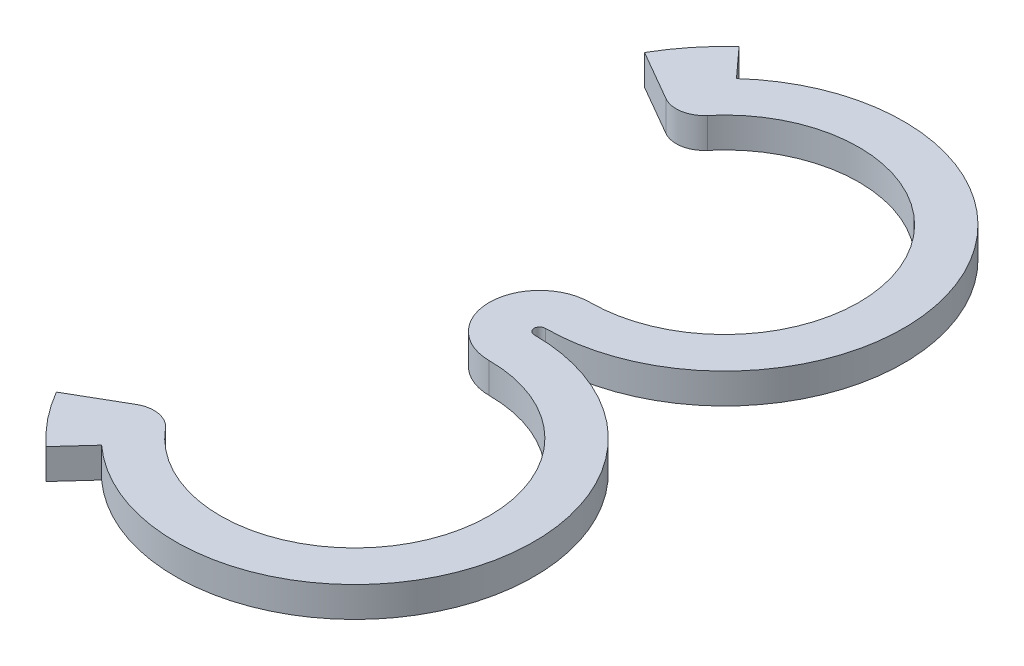
ISO-10303-21;
HEADER;
FILE_DESCRIPTION(('STEP AP214'),'2;1');
FILE_NAME('part.step','',(''),(''),'','','');
FILE_SCHEMA(('AUTOMOTIVE_DESIGN { 1 0 10303 214 1 1 1 1 }'));
ENDSEC;
DATA;
#1=APPLICATION_CONTEXT('core data for automotive mechanical design processes');
#2=APPLICATION_PROTOCOL_DEFINITION('international standard','automotive_design',2000,#1);
#3=PRODUCT_CONTEXT('',#1,'mechanical');
#4=PRODUCT('Part','Part','',(#3));
#5=PRODUCT_RELATED_PRODUCT_CATEGORY('part','',(#4));
#6=PRODUCT_DEFINITION_FORMATION('','',#4);
#7=PRODUCT_DEFINITION_CONTEXT('part definition',#1,'design');
#8=PRODUCT_DEFINITION('design','',#6,#7);
#9=PRODUCT_DEFINITION_SHAPE('','',#8);
#10=(LENGTH_UNIT() NAMED_UNIT(*) SI_UNIT(.MILLI.,.METRE.));
#11=(NAMED_UNIT(*) PLANE_ANGLE_UNIT() SI_UNIT($,.RADIAN.));
#12=(NAMED_UNIT(*) SI_UNIT($,.STERADIAN.) SOLID_ANGLE_UNIT());
#13=UNCERTAINTY_MEASURE_WITH_UNIT(LENGTH_MEASURE(1.E-05),#10,'distance_accuracy_value','');
#14=(GEOMETRIC_REPRESENTATION_CONTEXT(3) GLOBAL_UNCERTAINTY_ASSIGNED_CONTEXT((#13)) GLOBAL_UNIT_ASSIGNED_CONTEXT((#10,
#11,#12)) REPRESENTATION_CONTEXT('',''));
#15=CARTESIAN_POINT('',(0.,0.,0.));
#16=DIRECTION('',(0.,0.,1.));
#17=DIRECTION('',(1.,0.,0.));
#18=AXIS2_PLACEMENT_3D('',#15,#16,#17);
#19=CARTESIAN_POINT('',(-11.1193168768529,2.7,-9.306491938004));
#20=DIRECTION('',(0.,-1.,0.));
#21=DIRECTION('',(0.,0.,-1.));
#22=AXIS2_PLACEMENT_3D('',#19,#20,#21);
#23=CYLINDRICAL_SURFACE('',#22,2.5);
#24=CARTESIAN_POINT('',(-11.1193168768529,0.,-9.306491938004));
#25=DIRECTION('',(0.,1.,0.));
#26=DIRECTION('',(0.,0.,-1.));
#27=AXIS2_PLACEMENT_3D('',#24,#25,#26);
#28=CIRCLE('',#27,2.5);
#29=CARTESIAN_POINT('',(-12.3693168768529,0.,-7.1414284285429));
#30=VERTEX_POINT('',#29);
#31=CARTESIAN_POINT('',(-9.20219327739554,0.,-7.70192436248606));
#32=VERTEX_POINT('',#31);
#33=EDGE_CURVE('E176',#30,#32,#28,.T.);
#34=ORIENTED_EDGE('',*,*,#33,.T.);
#35=DIRECTION('',(0.,-1.,0.));
#36=VECTOR('',#35,1.);
#37=CARTESIAN_POINT('',(-9.20219327739554,2.7,-7.70192436248606));
#38=LINE('',#37,#36);
#39=CARTESIAN_POINT('',(-9.20219327739554,2.7,-7.70192436248606));
#40=VERTEX_POINT('',#39);
#41=EDGE_CURVE('E11',#40,#32,#38,.T.);
#42=ORIENTED_EDGE('',*,*,#41,.F.);
#43=CARTESIAN_POINT('',(-11.1193168768529,2.7,-9.306491938004));
#44=DIRECTION('',(0.,1.,0.));
#45=DIRECTION('',(0.,0.,-1.));
#46=AXIS2_PLACEMENT_3D('',#43,#44,#45);
#47=CIRCLE('',#46,2.5);
#48=CARTESIAN_POINT('',(-12.3693168768529,2.7,-7.1414284285429));
#49=VERTEX_POINT('',#48);
#50=EDGE_CURVE('E216',#49,#40,#47,.T.);
#51=ORIENTED_EDGE('',*,*,#50,.F.);
#52=DIRECTION('',(0.,-1.,0.));
#53=VECTOR('',#52,1.);
#54=CARTESIAN_POINT('',(-12.3693168768529,2.7,-7.1414284285429));
#55=LINE('',#54,#53);
#56=EDGE_CURVE('E172',#49,#30,#55,.T.);
#57=ORIENTED_EDGE('',*,*,#56,.T.);
#58=EDGE_LOOP('',(#34,#42,#51,#57));
#59=FACE_BOUND('',#58,.T.);
#60=ADVANCED_FACE('F39',(#59),#23,.T.);
#61=CARTESIAN_POINT('',(0.,2.7,0.));
#62=DIRECTION('',(0.,-1.,0.));
#63=DIRECTION('',(0.,0.,-1.));
#64=AXIS2_PLACEMENT_3D('',#61,#62,#63);
#65=CYLINDRICAL_SURFACE('',#64,12.);
#66=CARTESIAN_POINT('',(0.,0.,0.));
#67=DIRECTION('',(0.,-1.,0.));
#68=DIRECTION('',(0.,0.,1.));
#69=AXIS2_PLACEMENT_3D('',#66,#67,#68);
#70=CIRCLE('',#69,12.);
#71=CARTESIAN_POINT('',(0.,0.,12.));
#72=VERTEX_POINT('',#71);
#73=EDGE_CURVE('E180',#32,#72,#70,.T.);
#74=ORIENTED_EDGE('',*,*,#73,.T.);
#75=DIRECTION('',(0.,-1.,0.));
#76=VECTOR('',#75,1.);
#77=CARTESIAN_POINT('',(0.,2.7,12.));
#78=LINE('',#77,#76);
#79=CARTESIAN_POINT('',(0.,2.7,12.));
#80=VERTEX_POINT('',#79);
#81=EDGE_CURVE('E48',#80,#72,#78,.T.);
#82=ORIENTED_EDGE('',*,*,#81,.F.);
#83=CARTESIAN_POINT('',(0.,2.7,0.));
#84=DIRECTION('',(0.,-1.,0.));
#85=DIRECTION('',(0.,0.,1.));
#86=AXIS2_PLACEMENT_3D('',#83,#84,#85);
#87=CIRCLE('',#86,12.);
#88=EDGE_CURVE('E117',#40,#80,#87,.T.);
#89=ORIENTED_EDGE('',*,*,#88,.F.);
#90=ORIENTED_EDGE('',*,*,#41,.T.);
#91=EDGE_LOOP('',(#74,#82,#89,#90));
#92=FACE_BOUND('',#91,.T.);
#93=ADVANCED_FACE('F324',(#92),#65,.F.);
#94=CARTESIAN_POINT('',(0.,2.7,16.5));
#95=DIRECTION('',(0.,-1.,0.));
#96=DIRECTION('',(0.,0.,-1.));
#97=AXIS2_PLACEMENT_3D('',#94,#95,#96);
#98=CYLINDRICAL_SURFACE('',#97,4.5);
#99=CARTESIAN_POINT('',(0.,0.,16.5));
#100=DIRECTION('',(0.,1.,0.));
#101=DIRECTION('',(0.,0.,1.));
#102=AXIS2_PLACEMENT_3D('',#99,#100,#101);
#103=CIRCLE('',#102,4.5);
#104=CARTESIAN_POINT('',(0.,0.,21.));
#105=VERTEX_POINT('',#104);
#106=EDGE_CURVE('E183',#72,#105,#103,.T.);
#107=ORIENTED_EDGE('',*,*,#106,.T.);
#108=DIRECTION('',(0.,-1.,0.));
#109=VECTOR('',#108,1.);
#110=CARTESIAN_POINT('',(0.,2.7,21.));
#111=LINE('',#110,#109);
#112=CARTESIAN_POINT('',(0.,2.7,21.));
#113=VERTEX_POINT('',#112);
#114=EDGE_CURVE('E251',#113,#105,#111,.T.);
#115=ORIENTED_EDGE('',*,*,#114,.F.);
#116=CARTESIAN_POINT('',(0.,2.7,16.5));
#117=DIRECTION('',(0.,1.,0.));
#118=DIRECTION('',(0.,0.,1.));
#119=AXIS2_PLACEMENT_3D('',#116,#117,#118);
#120=CIRCLE('',#119,4.5);
#121=EDGE_CURVE('E261',#80,#113,#120,.T.);
#122=ORIENTED_EDGE('',*,*,#121,.F.);
#123=ORIENTED_EDGE('',*,*,#81,.T.);
#124=EDGE_LOOP('',(#107,#115,#122,#123));
#125=FACE_BOUND('',#124,.T.);
#126=ADVANCED_FACE('F259',(#125),#98,.T.);
#127=CARTESIAN_POINT('',(0.,2.7,33.));
#128=DIRECTION('',(0.,-1.,0.));
#129=DIRECTION('',(0.,0.,-1.));
#130=AXIS2_PLACEMENT_3D('',#127,#128,#129);
#131=CYLINDRICAL_SURFACE('',#130,12.);
#132=CARTESIAN_POINT('',(0.,0.,33.));
#133=DIRECTION('',(0.,-1.,0.));
#134=DIRECTION('',(0.,0.,-1.));
#135=AXIS2_PLACEMENT_3D('',#132,#133,#134);
#136=CIRCLE('',#135,12.);
#137=CARTESIAN_POINT('',(-9.20219327739554,0.,40.7019243624861));
#138=VERTEX_POINT('',#137);
#139=EDGE_CURVE('E186',#105,#138,#136,.T.);
#140=ORIENTED_EDGE('',*,*,#139,.T.);
#141=DIRECTION('',(0.,-1.,0.));
#142=VECTOR('',#141,1.);
#143=CARTESIAN_POINT('',(-9.20219327739554,2.7,40.7019243624861));
#144=LINE('',#143,#142);
#145=CARTESIAN_POINT('',(-9.20219327739554,2.7,40.7019243624861));
#146=VERTEX_POINT('',#145);
#147=EDGE_CURVE('E247',#146,#138,#144,.T.);
#148=ORIENTED_EDGE('',*,*,#147,.F.);
#149=CARTESIAN_POINT('',(0.,2.7,33.));
#150=DIRECTION('',(0.,-1.,0.));
#151=DIRECTION('',(0.,0.,-1.));
#152=AXIS2_PLACEMENT_3D('',#149,#150,#151);
#153=CIRCLE('',#152,12.);
#154=EDGE_CURVE('E280',#113,#146,#153,.T.);
#155=ORIENTED_EDGE('',*,*,#154,.F.);
#156=ORIENTED_EDGE('',*,*,#114,.T.);
#157=EDGE_LOOP('',(#140,#148,#155,#156));
#158=FACE_BOUND('',#157,.T.);
#159=ADVANCED_FACE('F270',(#158),#131,.F.);
#160=CARTESIAN_POINT('',(-11.1193168768529,2.7,42.306491938004));
#161=DIRECTION('',(0.,-1.,0.));
#162=DIRECTION('',(0.,0.,-1.));
#163=AXIS2_PLACEMENT_3D('',#160,#161,#162);
#164=CYLINDRICAL_SURFACE('',#163,2.5);
#165=CARTESIAN_POINT('',(-11.1193168768529,0.,42.306491938004));
#166=DIRECTION('',(0.,1.,0.));
#167=DIRECTION('',(0.,0.,1.));
#168=AXIS2_PLACEMENT_3D('',#165,#166,#167);
#169=CIRCLE('',#168,2.5);
#170=CARTESIAN_POINT('',(-12.3693168768529,0.,40.1414284285429));
#171=VERTEX_POINT('',#170);
#172=EDGE_CURVE('E189',#138,#171,#169,.T.);
#173=ORIENTED_EDGE('',*,*,#172,.T.);
#174=DIRECTION('',(0.,-1.,0.));
#175=VECTOR('',#174,1.);
#176=CARTESIAN_POINT('',(-12.3693168768529,2.7,40.1414284285429));
#177=LINE('',#176,#175);
#178=CARTESIAN_POINT('',(-12.3693168768529,2.7,40.1414284285429));
#179=VERTEX_POINT('',#178);
#180=EDGE_CURVE('E243',#179,#171,#177,.T.);
#181=ORIENTED_EDGE('',*,*,#180,.F.);
#182=CARTESIAN_POINT('',(-11.1193168768529,2.7,42.306491938004));
#183=DIRECTION('',(0.,1.,0.));
#184=DIRECTION('',(0.,0.,1.));
#185=AXIS2_PLACEMENT_3D('',#182,#183,#184);
#186=CIRCLE('',#185,2.5);
#187=EDGE_CURVE('E276',#146,#179,#186,.T.);
#188=ORIENTED_EDGE('',*,*,#187,.F.);
#189=ORIENTED_EDGE('',*,*,#147,.T.);
#190=EDGE_LOOP('',(#173,#181,#188,#189));
#191=FACE_BOUND('',#190,.T.);
#192=ADVANCED_FACE('F274',(#191),#164,.T.);
#193=CARTESIAN_POINT('',(-12.3693168768529,2.7,40.1414284285429));
#194=DIRECTION('',(0.500000000000004,0.,0.866025403784436));
#195=DIRECTION('',(0.866025403784437,0.,-0.500000000000004));
#196=AXIS2_PLACEMENT_3D('',#193,#194,#195);
#197=PLANE('',#196);
#198=DIRECTION('',(-0.866025403784436,0.,0.500000000000004));
#199=VECTOR('',#198,1.);
#200=CARTESIAN_POINT('',(-12.3693168768529,0.,40.1414284285429));
#201=LINE('',#200,#199);
#202=CARTESIAN_POINT('',(-16.8874953737965,0.,42.7500000000001));
#203=VERTEX_POINT('',#202);
#204=EDGE_CURVE('E192',#171,#203,#201,.T.);
#205=ORIENTED_EDGE('',*,*,#204,.T.);
#206=DIRECTION('',(0.,-1.,0.));
#207=VECTOR('',#206,1.);
#208=CARTESIAN_POINT('',(-16.8874953737965,2.7,42.7500000000001));
#209=LINE('',#208,#207);
#210=CARTESIAN_POINT('',(-16.8874953737965,2.7,42.7500000000001));
#211=VERTEX_POINT('',#210);
#212=EDGE_CURVE('E239',#211,#203,#209,.T.);
#213=ORIENTED_EDGE('',*,*,#212,.F.);
#214=DIRECTION('',(-0.866025403784436,0.,0.500000000000004));
#215=VECTOR('',#214,1.);
#216=CARTESIAN_POINT('',(-12.3693168768529,2.7,40.1414284285429));
#217=LINE('',#216,#215);
#218=EDGE_CURVE('E279',#179,#211,#217,.T.);
#219=ORIENTED_EDGE('',*,*,#218,.F.);
#220=ORIENTED_EDGE('',*,*,#180,.T.);
#221=EDGE_LOOP('',(#205,#213,#219,#220));
#222=FACE_BOUND('',#221,.T.);
#223=ADVANCED_FACE('F337',(#222),#197,.F.);
#224=CARTESIAN_POINT('',(0.,2.7,33.));
#225=DIRECTION('',(0.,-1.,0.));
#226=DIRECTION('',(0.,0.,-1.));
#227=AXIS2_PLACEMENT_3D('',#224,#225,#226);
#228=CYLINDRICAL_SURFACE('',#227,19.5);
#229=CARTESIAN_POINT('',(0.,0.,33.));
#230=DIRECTION('',(0.,1.,0.));
#231=DIRECTION('',(0.,0.,1.));
#232=AXIS2_PLACEMENT_3D('',#229,#230,#231);
#233=CIRCLE('',#232,19.5);
#234=CARTESIAN_POINT('',(-13.1238028675343,0.,47.4227527987586));
#235=VERTEX_POINT('',#234);
#236=EDGE_CURVE('E195',#203,#235,#233,.T.);
#237=ORIENTED_EDGE('',*,*,#236,.T.);
#238=DIRECTION('',(0.,-1.,0.));
#239=VECTOR('',#238,1.);
#240=CARTESIAN_POINT('',(-13.1238028675343,2.7,47.4227527987586));
#241=LINE('',#240,#239);
#242=CARTESIAN_POINT('',(-13.1238028675343,2.7,47.4227527987586));
#243=VERTEX_POINT('',#242);
#244=EDGE_CURVE('E235',#243,#235,#241,.T.);
#245=ORIENTED_EDGE('',*,*,#244,.F.);
#246=CARTESIAN_POINT('',(0.,2.7,33.));
#247=DIRECTION('',(0.,1.,0.));
#248=DIRECTION('',(0.,0.,1.));
#249=AXIS2_PLACEMENT_3D('',#246,#247,#248);
#250=CIRCLE('',#249,19.5);
#251=EDGE_CURVE('E284',#211,#243,#250,.T.);
#252=ORIENTED_EDGE('',*,*,#251,.F.);
#253=ORIENTED_EDGE('',*,*,#212,.T.);
#254=EDGE_LOOP('',(#237,#245,#252,#253));
#255=FACE_BOUND('',#254,.T.);
#256=ADVANCED_FACE('F340',(#255),#228,.T.);
#257=CARTESIAN_POINT('',(-10.7682485066948,2.7,44.8340535784686));
#258=DIRECTION('',(-0.739628348654287,0.,-0.673015531668425));
#259=DIRECTION('',(-0.673015531668425,0.,0.739628348654287));
#260=AXIS2_PLACEMENT_3D('',#257,#258,#259);
#261=PLANE('',#260);
#262=DIRECTION('',(0.673015531668425,0.,-0.739628348654287));
#263=VECTOR('',#262,1.);
#264=CARTESIAN_POINT('',(-10.7682485066948,0.,44.8340535784686));
#265=LINE('',#264,#263);
#266=CARTESIAN_POINT('',(-10.7682485066948,0.,44.8340535784686));
#267=VERTEX_POINT('',#266);
#268=EDGE_CURVE('E198',#235,#267,#265,.T.);
#269=ORIENTED_EDGE('',*,*,#268,.T.);
#270=DIRECTION('',(0.,-1.,0.));
#271=VECTOR('',#270,1.);
#272=CARTESIAN_POINT('',(-10.7682485066948,2.7,44.8340535784686));
#273=LINE('',#272,#271);
#274=CARTESIAN_POINT('',(-10.7682485066948,2.7,44.8340535784686));
#275=VERTEX_POINT('',#274);
#276=EDGE_CURVE('E231',#275,#267,#273,.T.);
#277=ORIENTED_EDGE('',*,*,#276,.F.);
#278=DIRECTION('',(0.673015531668425,0.,-0.739628348654287));
#279=VECTOR('',#278,1.);
#280=CARTESIAN_POINT('',(-10.7682485066948,2.7,44.8340535784686));
#281=LINE('',#280,#279);
#282=EDGE_CURVE('E291',#243,#275,#281,.T.);
#283=ORIENTED_EDGE('',*,*,#282,.F.);
#284=ORIENTED_EDGE('',*,*,#244,.T.);
#285=EDGE_LOOP('',(#269,#277,#283,#284));
#286=FACE_BOUND('',#285,.T.);
#287=ADVANCED_FACE('F344',(#286),#261,.F.);
#288=CARTESIAN_POINT('',(0.,2.7,33.));
#289=DIRECTION('',(0.,-1.,0.));
#290=DIRECTION('',(0.,0.,-1.));
#291=AXIS2_PLACEMENT_3D('',#288,#289,#290);
#292=CYLINDRICAL_SURFACE('',#291,16.);
#293=CARTESIAN_POINT('',(0.,0.,33.));
#294=DIRECTION('',(0.,1.,0.));
#295=DIRECTION('',(0.,0.,-1.));
#296=AXIS2_PLACEMENT_3D('',#293,#294,#295);
#297=CIRCLE('',#296,16.);
#298=CARTESIAN_POINT('',(0.,0.,17.));
#299=VERTEX_POINT('',#298);
#300=EDGE_CURVE('E201',#267,#299,#297,.T.);
#301=ORIENTED_EDGE('',*,*,#300,.T.);
#302=DIRECTION('',(0.,-1.,0.));
#303=VECTOR('',#302,1.);
#304=CARTESIAN_POINT('',(0.,2.7,17.));
#305=LINE('',#304,#303);
#306=CARTESIAN_POINT('',(0.,2.7,17.));
#307=VERTEX_POINT('',#306);
#308=EDGE_CURVE('E227',#307,#299,#305,.T.);
#309=ORIENTED_EDGE('',*,*,#308,.F.);
#310=CARTESIAN_POINT('',(0.,2.7,33.));
#311=DIRECTION('',(0.,1.,0.));
#312=DIRECTION('',(0.,0.,-1.));
#313=AXIS2_PLACEMENT_3D('',#310,#311,#312);
#314=CIRCLE('',#313,16.);
#315=EDGE_CURVE('E294',#275,#307,#314,.T.);
#316=ORIENTED_EDGE('',*,*,#315,.F.);
#317=ORIENTED_EDGE('',*,*,#276,.T.);
#318=EDGE_LOOP('',(#301,#309,#316,#317));
#319=FACE_BOUND('',#318,.T.);
#320=ADVANCED_FACE('F348',(#319),#292,.T.);
#321=CARTESIAN_POINT('',(0.,2.7,16.5));
#322=DIRECTION('',(0.,-1.,0.));
#323=DIRECTION('',(0.,0.,-1.));
#324=AXIS2_PLACEMENT_3D('',#321,#322,#323);
#325=CYLINDRICAL_SURFACE('',#324,0.5);
#326=CARTESIAN_POINT('',(0.,0.,16.5));
#327=DIRECTION('',(0.,-1.,0.));
#328=DIRECTION('',(0.,0.,1.));
#329=AXIS2_PLACEMENT_3D('',#326,#327,#328);
#330=CIRCLE('',#329,0.5);
#331=CARTESIAN_POINT('',(0.,0.,16.));
#332=VERTEX_POINT('',#331);
#333=EDGE_CURVE('E204',#299,#332,#330,.T.);
#334=ORIENTED_EDGE('',*,*,#333,.T.);
#335=DIRECTION('',(0.,-1.,0.));
#336=VECTOR('',#335,1.);
#337=CARTESIAN_POINT('',(0.,2.7,16.));
#338=LINE('',#337,#336);
#339=CARTESIAN_POINT('',(0.,2.7,16.));
#340=VERTEX_POINT('',#339);
#341=EDGE_CURVE('E223',#340,#332,#338,.T.);
#342=ORIENTED_EDGE('',*,*,#341,.F.);
#343=CARTESIAN_POINT('',(0.,2.7,16.5));
#344=DIRECTION('',(0.,-1.,0.));
#345=DIRECTION('',(0.,0.,1.));
#346=AXIS2_PLACEMENT_3D('',#343,#344,#345);
#347=CIRCLE('',#346,0.5);
#348=EDGE_CURVE('E297',#307,#340,#347,.T.);
#349=ORIENTED_EDGE('',*,*,#348,.F.);
#350=ORIENTED_EDGE('',*,*,#308,.T.);
#351=EDGE_LOOP('',(#334,#342,#349,#350));
#352=FACE_BOUND('',#351,.T.);
#353=ADVANCED_FACE('F305',(#352),#325,.F.);
#354=CARTESIAN_POINT('',(0.,2.7,0.));
#355=DIRECTION('',(0.,-1.,0.));
#356=DIRECTION('',(0.,0.,-1.));
#357=AXIS2_PLACEMENT_3D('',#354,#355,#356);
#358=CYLINDRICAL_SURFACE('',#357,16.);
#359=CARTESIAN_POINT('',(0.,0.,0.));
#360=DIRECTION('',(0.,1.,0.));
#361=DIRECTION('',(0.,0.,1.));
#362=AXIS2_PLACEMENT_3D('',#359,#360,#361);
#363=CIRCLE('',#362,16.);
#364=CARTESIAN_POINT('',(-10.7682485066948,0.,-11.8340535784686));
#365=VERTEX_POINT('',#364);
#366=EDGE_CURVE('E207',#332,#365,#363,.T.);
#367=ORIENTED_EDGE('',*,*,#366,.T.);
#368=DIRECTION('',(0.,-1.,0.));
#369=VECTOR('',#368,1.);
#370=CARTESIAN_POINT('',(-10.7682485066948,2.7,-11.8340535784686));
#371=LINE('',#370,#369);
#372=CARTESIAN_POINT('',(-10.7682485066948,2.7,-11.8340535784686));
#373=VERTEX_POINT('',#372);
#374=EDGE_CURVE('E165',#373,#365,#371,.T.);
#375=ORIENTED_EDGE('',*,*,#374,.F.);
#376=CARTESIAN_POINT('',(0.,2.7,0.));
#377=DIRECTION('',(0.,1.,0.));
#378=DIRECTION('',(0.,0.,1.));
#379=AXIS2_PLACEMENT_3D('',#376,#377,#378);
#380=CIRCLE('',#379,16.);
#381=EDGE_CURVE('E154',#340,#373,#380,.T.);
#382=ORIENTED_EDGE('',*,*,#381,.F.);
#383=ORIENTED_EDGE('',*,*,#341,.T.);
#384=EDGE_LOOP('',(#367,#375,#382,#383));
#385=FACE_BOUND('',#384,.T.);
#386=ADVANCED_FACE('F309',(#385),#358,.T.);
#387=CARTESIAN_POINT('',(-10.7682485066948,2.7,-11.8340535784686));
#388=DIRECTION('',(-0.739628348654287,0.,0.673015531668425));
#389=DIRECTION('',(0.673015531668425,0.,0.739628348654287));
#390=AXIS2_PLACEMENT_3D('',#387,#388,#389);
#391=PLANE('',#390);
#392=DIRECTION('',(-0.673015531668425,0.,-0.739628348654287));
#393=VECTOR('',#392,1.);
#394=CARTESIAN_POINT('',(-10.7682485066948,0.,-11.8340535784686));
#395=LINE('',#394,#393);
#396=CARTESIAN_POINT('',(-13.1238028675343,0.,-14.4227527987586));
#397=VERTEX_POINT('',#396);
#398=EDGE_CURVE('E163',#365,#397,#395,.T.);
#399=ORIENTED_EDGE('',*,*,#398,.T.);
#400=DIRECTION('',(0.,-1.,0.));
#401=VECTOR('',#400,1.);
#402=CARTESIAN_POINT('',(-13.1238028675343,2.7,-14.4227527987586));
#403=LINE('',#402,#401);
#404=CARTESIAN_POINT('',(-13.1238028675343,2.7,-14.4227527987586));
#405=VERTEX_POINT('',#404);
#406=EDGE_CURVE('E160',#405,#397,#403,.T.);
#407=ORIENTED_EDGE('',*,*,#406,.F.);
#408=DIRECTION('',(-0.673015531668425,0.,-0.739628348654287));
#409=VECTOR('',#408,1.);
#410=CARTESIAN_POINT('',(-10.7682485066948,2.7,-11.8340535784686));
#411=LINE('',#410,#409);
#412=EDGE_CURVE('E148',#373,#405,#411,.T.);
#413=ORIENTED_EDGE('',*,*,#412,.F.);
#414=ORIENTED_EDGE('',*,*,#374,.T.);
#415=EDGE_LOOP('',(#399,#407,#413,#414));
#416=FACE_BOUND('',#415,.T.);
#417=ADVANCED_FACE('F161',(#416),#391,.F.);
#418=CARTESIAN_POINT('',(0.,2.7,0.));
#419=DIRECTION('',(0.,-1.,0.));
#420=DIRECTION('',(0.,0.,-1.));
#421=AXIS2_PLACEMENT_3D('',#418,#419,#420);
#422=CYLINDRICAL_SURFACE('',#421,19.5);
#423=CARTESIAN_POINT('',(0.,0.,0.));
#424=DIRECTION('',(0.,1.,0.));
#425=DIRECTION('',(0.,0.,-1.));
#426=AXIS2_PLACEMENT_3D('',#423,#424,#425);
#427=CIRCLE('',#426,19.5);
#428=CARTESIAN_POINT('',(-16.8874953737965,0.,-9.75000000000008));
#429=VERTEX_POINT('',#428);
#430=EDGE_CURVE('E103',#397,#429,#427,.T.);
#431=ORIENTED_EDGE('',*,*,#430,.T.);
#432=DIRECTION('',(0.,-1.,0.));
#433=VECTOR('',#432,1.);
#434=CARTESIAN_POINT('',(-16.8874953737965,2.7,-9.75000000000008));
#435=LINE('',#434,#433);
#436=CARTESIAN_POINT('',(-16.8874953737965,2.7,-9.75000000000008));
#437=VERTEX_POINT('',#436);
#438=EDGE_CURVE('E166',#437,#429,#435,.T.);
#439=ORIENTED_EDGE('',*,*,#438,.F.);
#440=CARTESIAN_POINT('',(0.,2.7,0.));
#441=DIRECTION('',(0.,1.,0.));
#442=DIRECTION('',(0.,0.,-1.));
#443=AXIS2_PLACEMENT_3D('',#440,#441,#442);
#444=CIRCLE('',#443,19.5);
#445=EDGE_CURVE('E152',#405,#437,#444,.T.);
#446=ORIENTED_EDGE('',*,*,#445,.F.);
#447=ORIENTED_EDGE('',*,*,#406,.T.);
#448=EDGE_LOOP('',(#431,#439,#446,#447));
#449=FACE_BOUND('',#448,.T.);
#450=ADVANCED_FACE('F168',(#449),#422,.T.);
#451=CARTESIAN_POINT('',(-12.3693168768529,2.7,-7.1414284285429));
#452=DIRECTION('',(0.500000000000004,0.,-0.866025403784436));
#453=DIRECTION('',(-0.866025403784436,0.,-0.500000000000004));
#454=AXIS2_PLACEMENT_3D('',#451,#452,#453);
#455=PLANE('',#454);
#456=DIRECTION('',(0.866025403784436,0.,0.500000000000004));
#457=VECTOR('',#456,1.);
#458=CARTESIAN_POINT('',(-12.3693168768529,0.,-7.1414284285429));
#459=LINE('',#458,#457);
#460=EDGE_CURVE('E109',#429,#30,#459,.T.);
#461=ORIENTED_EDGE('',*,*,#460,.T.);
#462=ORIENTED_EDGE('',*,*,#56,.F.);
#463=DIRECTION('',(0.866025403784436,0.,0.500000000000004));
#464=VECTOR('',#463,1.);
#465=CARTESIAN_POINT('',(-12.3693168768529,2.7,-7.1414284285429));
#466=LINE('',#465,#464);
#467=EDGE_CURVE('E56',#437,#49,#466,.T.);
#468=ORIENTED_EDGE('',*,*,#467,.F.);
#469=ORIENTED_EDGE('',*,*,#438,.T.);
#470=EDGE_LOOP('',(#461,#462,#468,#469));
#471=FACE_BOUND('',#470,.T.);
#472=ADVANCED_FACE('F313',(#471),#455,.F.);
#473=CARTESIAN_POINT('',(-11.1193168768529,2.7,-9.306491938004));
#474=DIRECTION('',(0.,-1.,0.));
#475=DIRECTION('',(0.,0.,-1.));
#476=AXIS2_PLACEMENT_3D('',#473,#474,#475);
#477=PLANE('',#476);
#478=ORIENTED_EDGE('',*,*,#50,.T.);
#479=ORIENTED_EDGE('',*,*,#88,.T.);
#480=ORIENTED_EDGE('',*,*,#121,.T.);
#481=ORIENTED_EDGE('',*,*,#154,.T.);
#482=ORIENTED_EDGE('',*,*,#187,.T.);
#483=ORIENTED_EDGE('',*,*,#218,.T.);
#484=ORIENTED_EDGE('',*,*,#251,.T.);
#485=ORIENTED_EDGE('',*,*,#282,.T.);
#486=ORIENTED_EDGE('',*,*,#315,.T.);
#487=ORIENTED_EDGE('',*,*,#348,.T.);
#488=ORIENTED_EDGE('',*,*,#381,.T.);
#489=ORIENTED_EDGE('',*,*,#412,.T.);
#490=ORIENTED_EDGE('',*,*,#445,.T.);
#491=ORIENTED_EDGE('',*,*,#467,.T.);
#492=EDGE_LOOP('',(#478,#479,#480,#481,#482,#483,#484,#485,#486,#487,#488,#489,#490,#491));
#493=FACE_BOUND('',#492,.T.);
#494=ADVANCED_FACE('F150',(#493),#477,.F.);
#495=CARTESIAN_POINT('',(-11.1193168768529,0.,-9.306491938004));
#496=DIRECTION('',(0.,-1.,0.));
#497=DIRECTION('',(0.,0.,-1.));
#498=AXIS2_PLACEMENT_3D('',#495,#496,#497);
#499=PLANE('',#498);
#500=ORIENTED_EDGE('',*,*,#33,.F.);
#501=ORIENTED_EDGE('',*,*,#460,.F.);
#502=ORIENTED_EDGE('',*,*,#430,.F.);
#503=ORIENTED_EDGE('',*,*,#398,.F.);
#504=ORIENTED_EDGE('',*,*,#366,.F.);
#505=ORIENTED_EDGE('',*,*,#333,.F.);
#506=ORIENTED_EDGE('',*,*,#300,.F.);
#507=ORIENTED_EDGE('',*,*,#268,.F.);
#508=ORIENTED_EDGE('',*,*,#236,.F.);
#509=ORIENTED_EDGE('',*,*,#204,.F.);
#510=ORIENTED_EDGE('',*,*,#172,.F.);
#511=ORIENTED_EDGE('',*,*,#139,.F.);
#512=ORIENTED_EDGE('',*,*,#106,.F.);
#513=ORIENTED_EDGE('',*,*,#73,.F.);
#514=EDGE_LOOP('',(#500,#501,#502,#503,#504,#505,#506,#507,#508,#509,#510,#511,#512,#513));
#515=FACE_BOUND('',#514,.T.);
#516=ADVANCED_FACE('F265',(#515),#499,.T.);
#517=CLOSED_SHELL('',(#60,#93,#126,#159,#192,#223,#256,#287,#320,#353,#386,#417,#450,#472,#494,#516));
#518=MANIFOLD_SOLID_BREP('B2',#517);
#519=ADVANCED_BREP_SHAPE_REPRESENTATION('',(#18,#518),#14);
#520=SHAPE_DEFINITION_REPRESENTATION(#9,#519);
ENDSEC;
END-ISO-10303-21;
